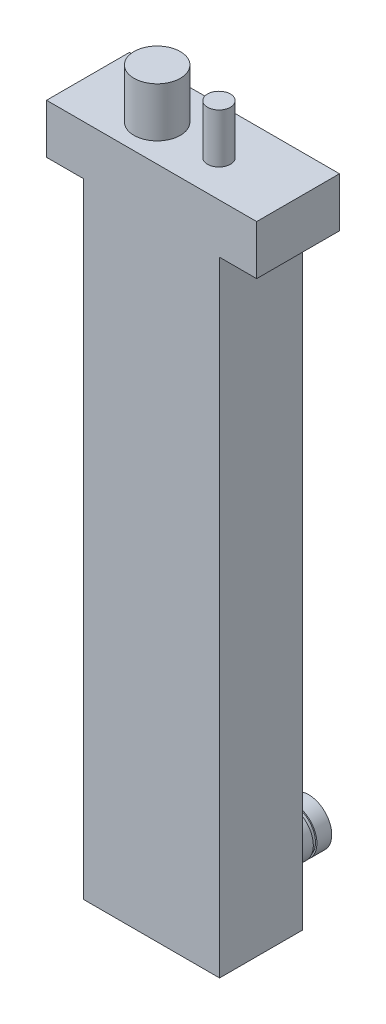
ISO-10303-21;
HEADER;
FILE_DESCRIPTION(('STEP AP214'),'2;1');
FILE_NAME('part.step','',(''),(''),'','','');
FILE_SCHEMA(('AUTOMOTIVE_DESIGN { 1 0 10303 214 1 1 1 1 }'));
ENDSEC;
DATA;
#1=APPLICATION_CONTEXT('core data for automotive mechanical design processes');
#2=APPLICATION_PROTOCOL_DEFINITION('international standard','automotive_design',2000,#1);
#3=PRODUCT_CONTEXT('',#1,'mechanical');
#4=PRODUCT('Part','Part','',(#3));
#5=PRODUCT_RELATED_PRODUCT_CATEGORY('part','',(#4));
#6=PRODUCT_DEFINITION_FORMATION('','',#4);
#7=PRODUCT_DEFINITION_CONTEXT('part definition',#1,'design');
#8=PRODUCT_DEFINITION('design','',#6,#7);
#9=PRODUCT_DEFINITION_SHAPE('','',#8);
#10=(LENGTH_UNIT() NAMED_UNIT(*) SI_UNIT(.MILLI.,.METRE.));
#11=(NAMED_UNIT(*) PLANE_ANGLE_UNIT() SI_UNIT($,.RADIAN.));
#12=(NAMED_UNIT(*) SI_UNIT($,.STERADIAN.) SOLID_ANGLE_UNIT());
#13=UNCERTAINTY_MEASURE_WITH_UNIT(LENGTH_MEASURE(1.E-05),#10,'distance_accuracy_value','');
#14=(GEOMETRIC_REPRESENTATION_CONTEXT(3) GLOBAL_UNCERTAINTY_ASSIGNED_CONTEXT((#13)) GLOBAL_UNIT_ASSIGNED_CONTEXT((#10,
#11,#12)) REPRESENTATION_CONTEXT('',''));
#15=CARTESIAN_POINT('',(0.,0.,0.));
#16=DIRECTION('',(0.,0.,1.));
#17=DIRECTION('',(1.,0.,0.));
#18=AXIS2_PLACEMENT_3D('',#15,#16,#17);
#19=CARTESIAN_POINT('',(0.,0.,0.));
#20=DIRECTION('',(0.,1.,0.));
#21=DIRECTION('',(0.,0.,1.));
#22=AXIS2_PLACEMENT_3D('',#19,#20,#21);
#23=PLANE('',#22);
#24=DIRECTION('',(1.,0.,0.));
#25=VECTOR('',#24,1.);
#26=CARTESIAN_POINT('',(0.,0.,7.493));
#27=LINE('',#26,#25);
#28=CARTESIAN_POINT('',(-26.67,0.,7.493));
#29=VERTEX_POINT('',#28);
#30=CARTESIAN_POINT('',(-19.05,0.,7.493));
#31=VERTEX_POINT('',#30);
#32=EDGE_CURVE('E172',#29,#31,#27,.T.);
#33=ORIENTED_EDGE('',*,*,#32,.F.);
#34=DIRECTION('',(0.,0.,1.));
#35=VECTOR('',#34,1.);
#36=CARTESIAN_POINT('',(-26.67,0.,-9.525));
#37=LINE('',#36,#35);
#38=CARTESIAN_POINT('',(-26.67,0.,-9.525));
#39=VERTEX_POINT('',#38);
#40=EDGE_CURVE('E214',#39,#29,#37,.T.);
#41=ORIENTED_EDGE('',*,*,#40,.F.);
#42=DIRECTION('',(-1.,0.,0.));
#43=VECTOR('',#42,1.);
#44=CARTESIAN_POINT('',(11.43,0.,-9.525));
#45=LINE('',#44,#43);
#46=CARTESIAN_POINT('',(-19.05,0.,-9.525));
#47=VERTEX_POINT('',#46);
#48=EDGE_CURVE('E114',#47,#39,#45,.T.);
#49=ORIENTED_EDGE('',*,*,#48,.F.);
#50=DIRECTION('',(0.,0.,-1.));
#51=VECTOR('',#50,1.);
#52=CARTESIAN_POINT('',(-19.05,0.,9.525));
#53=LINE('',#52,#51);
#54=EDGE_CURVE('E111',#31,#47,#53,.T.);
#55=ORIENTED_EDGE('',*,*,#54,.F.);
#56=EDGE_LOOP('',(#33,#41,#49,#55));
#57=FACE_BOUND('',#56,.T.);
#58=ADVANCED_FACE('F40',(#57),#23,.F.);
#59=DIRECTION('',(1.,0.,0.));
#60=VECTOR('',#59,1.);
#61=CARTESIAN_POINT('',(0.,0.,7.493));
#62=LINE('',#61,#60);
#63=CARTESIAN_POINT('',(8.89000000000001,0.,7.493));
#64=VERTEX_POINT('',#63);
#65=CARTESIAN_POINT('',(16.51,0.,7.493));
#66=VERTEX_POINT('',#65);
#67=EDGE_CURVE('E159',#64,#66,#62,.T.);
#68=ORIENTED_EDGE('',*,*,#67,.F.);
#69=DIRECTION('',(0.,0.,1.));
#70=VECTOR('',#69,1.);
#71=CARTESIAN_POINT('',(8.89000000000001,0.,9.525));
#72=LINE('',#71,#70);
#73=CARTESIAN_POINT('',(8.89000000000001,0.,-9.525));
#74=VERTEX_POINT('',#73);
#75=EDGE_CURVE('E128',#74,#64,#72,.T.);
#76=ORIENTED_EDGE('',*,*,#75,.F.);
#77=CARTESIAN_POINT('',(16.51,0.,-9.525));
#78=VERTEX_POINT('',#77);
#79=EDGE_CURVE('E118',#78,#74,#45,.T.);
#80=ORIENTED_EDGE('',*,*,#79,.F.);
#81=DIRECTION('',(0.,0.,-1.));
#82=VECTOR('',#81,1.);
#83=CARTESIAN_POINT('',(16.51,0.,9.52499999999999));
#84=LINE('',#83,#82);
#85=EDGE_CURVE('E123',#66,#78,#84,.T.);
#86=ORIENTED_EDGE('',*,*,#85,.F.);
#87=EDGE_LOOP('',(#68,#76,#80,#86));
#88=FACE_BOUND('',#87,.T.);
#89=ADVANCED_FACE('F234',(#88),#23,.F.);
#90=CARTESIAN_POINT('',(0.,10.16,0.));
#91=DIRECTION('',(0.,1.,0.));
#92=DIRECTION('',(0.,0.,1.));
#93=AXIS2_PLACEMENT_3D('',#90,#91,#92);
#94=PLANE('',#93);
#95=CARTESIAN_POINT('',(1.27000000000001,10.16,0.));
#96=DIRECTION('',(0.,1.,0.));
#97=DIRECTION('',(0.,0.,1.));
#98=AXIS2_PLACEMENT_3D('',#95,#96,#97);
#99=CIRCLE('',#98,2.35729593622905);
#100=CARTESIAN_POINT('',(1.27000000000001,10.16,2.35729593622905));
#101=VERTEX_POINT('',#100);
#102=EDGE_CURVE('E202',#101,#101,#99,.T.);
#103=ORIENTED_EDGE('',*,*,#102,.F.);
#104=EDGE_LOOP('',(#103));
#105=FACE_BOUND('',#104,.T.);
#106=CARTESIAN_POINT('',(-11.43,10.16,0.));
#107=DIRECTION('',(0.,1.,0.));
#108=DIRECTION('',(0.,0.,1.));
#109=AXIS2_PLACEMENT_3D('',#106,#107,#108);
#110=CIRCLE('',#109,4.7625);
#111=CARTESIAN_POINT('',(-11.43,10.16,4.7625));
#112=VERTEX_POINT('',#111);
#113=EDGE_CURVE('E194',#112,#112,#110,.T.);
#114=ORIENTED_EDGE('',*,*,#113,.F.);
#115=EDGE_LOOP('',(#114));
#116=FACE_BOUND('',#115,.T.);
#117=DIRECTION('',(0.,0.,-1.));
#118=VECTOR('',#117,1.);
#119=CARTESIAN_POINT('',(-26.67,10.16,-9.525));
#120=LINE('',#119,#118);
#121=CARTESIAN_POINT('',(-26.67,10.16,7.493));
#122=VERTEX_POINT('',#121);
#123=CARTESIAN_POINT('',(-26.67,10.16,-9.525));
#124=VERTEX_POINT('',#123);
#125=EDGE_CURVE('E211',#122,#124,#120,.T.);
#126=ORIENTED_EDGE('',*,*,#125,.F.);
#127=DIRECTION('',(-1.,0.,0.));
#128=VECTOR('',#127,1.);
#129=CARTESIAN_POINT('',(-26.67,10.16,7.493));
#130=LINE('',#129,#128);
#131=CARTESIAN_POINT('',(16.51,10.16,7.493));
#132=VERTEX_POINT('',#131);
#133=EDGE_CURVE('E160',#132,#122,#130,.T.);
#134=ORIENTED_EDGE('',*,*,#133,.F.);
#135=DIRECTION('',(0.,0.,1.));
#136=VECTOR('',#135,1.);
#137=CARTESIAN_POINT('',(16.51,10.16,9.52499999999999));
#138=LINE('',#137,#136);
#139=CARTESIAN_POINT('',(16.51,10.16,-9.525));
#140=VERTEX_POINT('',#139);
#141=EDGE_CURVE('E134',#140,#132,#138,.T.);
#142=ORIENTED_EDGE('',*,*,#141,.F.);
#143=DIRECTION('',(-1.,0.,0.));
#144=VECTOR('',#143,1.);
#145=CARTESIAN_POINT('',(11.43,10.16,-9.525));
#146=LINE('',#145,#144);
#147=EDGE_CURVE('E190',#140,#124,#146,.T.);
#148=ORIENTED_EDGE('',*,*,#147,.T.);
#149=EDGE_LOOP('',(#126,#134,#142,#148));
#150=FACE_BOUND('',#149,.T.);
#151=ADVANCED_FACE('F238',(#105,#116,#150),#94,.T.);
#152=CARTESIAN_POINT('',(-26.67,0.,0.));
#153=DIRECTION('',(1.,0.,0.));
#154=DIRECTION('',(0.,0.,-1.));
#155=AXIS2_PLACEMENT_3D('',#152,#153,#154);
#156=PLANE('',#155);
#157=DIRECTION('',(0.,-1.,0.));
#158=VECTOR('',#157,1.);
#159=CARTESIAN_POINT('',(-26.67,10.16,7.493));
#160=LINE('',#159,#158);
#161=EDGE_CURVE('E251',#122,#29,#160,.T.);
#162=ORIENTED_EDGE('',*,*,#161,.F.);
#163=ORIENTED_EDGE('',*,*,#125,.T.);
#164=DIRECTION('',(0.,-1.,0.));
#165=VECTOR('',#164,1.);
#166=CARTESIAN_POINT('',(-26.67,0.,-9.525));
#167=LINE('',#166,#165);
#168=EDGE_CURVE('E210',#124,#39,#167,.T.);
#169=ORIENTED_EDGE('',*,*,#168,.T.);
#170=ORIENTED_EDGE('',*,*,#40,.T.);
#171=EDGE_LOOP('',(#162,#163,#169,#170));
#172=FACE_BOUND('',#171,.T.);
#173=ADVANCED_FACE('F255',(#172),#156,.F.);
#174=CARTESIAN_POINT('',(16.51,0.,0.));
#175=DIRECTION('',(1.,0.,0.));
#176=DIRECTION('',(0.,0.,-1.));
#177=AXIS2_PLACEMENT_3D('',#174,#175,#176);
#178=PLANE('',#177);
#179=ORIENTED_EDGE('',*,*,#141,.T.);
#180=DIRECTION('',(0.,1.,0.));
#181=VECTOR('',#180,1.);
#182=CARTESIAN_POINT('',(16.51,10.16,7.493));
#183=LINE('',#182,#181);
#184=EDGE_CURVE('E166',#66,#132,#183,.T.);
#185=ORIENTED_EDGE('',*,*,#184,.F.);
#186=ORIENTED_EDGE('',*,*,#85,.T.);
#187=DIRECTION('',(0.,1.,0.));
#188=VECTOR('',#187,1.);
#189=CARTESIAN_POINT('',(16.51,10.16,-9.525));
#190=LINE('',#189,#188);
#191=EDGE_CURVE('E223',#78,#140,#190,.T.);
#192=ORIENTED_EDGE('',*,*,#191,.T.);
#193=EDGE_LOOP('',(#179,#185,#186,#192));
#194=FACE_BOUND('',#193,.T.);
#195=ADVANCED_FACE('F231',(#194),#178,.T.);
#196=CARTESIAN_POINT('',(-19.05,-128.27,9.525));
#197=DIRECTION('',(1.,0.,0.));
#198=DIRECTION('',(0.,0.,-1.));
#199=AXIS2_PLACEMENT_3D('',#196,#197,#198);
#200=PLANE('',#199);
#201=DIRECTION('',(0.,-1.,0.));
#202=VECTOR('',#201,1.);
#203=CARTESIAN_POINT('',(-19.05,-128.27,7.493));
#204=LINE('',#203,#202);
#205=CARTESIAN_POINT('',(-19.05,-128.27,7.493));
#206=VERTEX_POINT('',#205);
#207=EDGE_CURVE('E56',#31,#206,#204,.T.);
#208=ORIENTED_EDGE('',*,*,#207,.F.);
#209=ORIENTED_EDGE('',*,*,#54,.T.);
#210=DIRECTION('',(0.,1.,0.));
#211=VECTOR('',#210,1.);
#212=CARTESIAN_POINT('',(-19.05,-128.27,-9.525));
#213=LINE('',#212,#211);
#214=CARTESIAN_POINT('',(-19.05,-128.27,-9.525));
#215=VERTEX_POINT('',#214);
#216=EDGE_CURVE('E105',#215,#47,#213,.T.);
#217=ORIENTED_EDGE('',*,*,#216,.F.);
#218=DIRECTION('',(0.,0.,-1.));
#219=VECTOR('',#218,1.);
#220=CARTESIAN_POINT('',(-19.05,-128.27,9.525));
#221=LINE('',#220,#219);
#222=EDGE_CURVE('E91',#206,#215,#221,.T.);
#223=ORIENTED_EDGE('',*,*,#222,.F.);
#224=EDGE_LOOP('',(#208,#209,#217,#223));
#225=FACE_BOUND('',#224,.T.);
#226=ADVANCED_FACE('F109',(#225),#200,.F.);
#227=CARTESIAN_POINT('',(8.89000000000001,-128.27,9.525));
#228=DIRECTION('',(-1.,0.,0.));
#229=DIRECTION('',(0.,0.,1.));
#230=AXIS2_PLACEMENT_3D('',#227,#228,#229);
#231=PLANE('',#230);
#232=DIRECTION('',(0.,1.,0.));
#233=VECTOR('',#232,1.);
#234=CARTESIAN_POINT('',(8.89000000000001,-128.27,7.493));
#235=LINE('',#234,#233);
#236=CARTESIAN_POINT('',(8.89000000000001,-128.27,7.493));
#237=VERTEX_POINT('',#236);
#238=EDGE_CURVE('E152',#237,#64,#235,.T.);
#239=ORIENTED_EDGE('',*,*,#238,.F.);
#240=DIRECTION('',(0.,0.,1.));
#241=VECTOR('',#240,1.);
#242=CARTESIAN_POINT('',(8.89000000000001,-128.27,9.525));
#243=LINE('',#242,#241);
#244=CARTESIAN_POINT('',(8.89000000000001,-128.27,-9.525));
#245=VERTEX_POINT('',#244);
#246=EDGE_CURVE('E135',#245,#237,#243,.T.);
#247=ORIENTED_EDGE('',*,*,#246,.F.);
#248=DIRECTION('',(0.,1.,0.));
#249=VECTOR('',#248,1.);
#250=CARTESIAN_POINT('',(8.89000000000001,-128.27,-9.525));
#251=LINE('',#250,#249);
#252=EDGE_CURVE('E99',#245,#74,#251,.T.);
#253=ORIENTED_EDGE('',*,*,#252,.T.);
#254=ORIENTED_EDGE('',*,*,#75,.T.);
#255=EDGE_LOOP('',(#239,#247,#253,#254));
#256=FACE_BOUND('',#255,.T.);
#257=ADVANCED_FACE('F150',(#256),#231,.F.);
#258=CARTESIAN_POINT('',(0.,-128.27,0.));
#259=DIRECTION('',(0.,-1.,0.));
#260=DIRECTION('',(0.,0.,-1.));
#261=AXIS2_PLACEMENT_3D('',#258,#259,#260);
#262=PLANE('',#261);
#263=ORIENTED_EDGE('',*,*,#246,.T.);
#264=DIRECTION('',(-1.,0.,0.));
#265=VECTOR('',#264,1.);
#266=CARTESIAN_POINT('',(0.,-128.27,7.493));
#267=LINE('',#266,#265);
#268=EDGE_CURVE('E12',#237,#206,#267,.T.);
#269=ORIENTED_EDGE('',*,*,#268,.T.);
#270=ORIENTED_EDGE('',*,*,#222,.T.);
#271=DIRECTION('',(1.,0.,0.));
#272=VECTOR('',#271,1.);
#273=CARTESIAN_POINT('',(-19.05,-128.27,-9.525));
#274=LINE('',#273,#272);
#275=CARTESIAN_POINT('',(-5.07999999999999,-128.27,-9.525));
#276=VERTEX_POINT('',#275);
#277=EDGE_CURVE('E95',#215,#276,#274,.T.);
#278=ORIENTED_EDGE('',*,*,#277,.T.);
#279=EDGE_CURVE('E107',#276,#245,#274,.T.);
#280=ORIENTED_EDGE('',*,*,#279,.T.);
#281=EDGE_LOOP('',(#263,#269,#270,#278,#280));
#282=FACE_BOUND('',#281,.T.);
#283=ADVANCED_FACE('F94',(#282),#262,.T.);
#284=CARTESIAN_POINT('',(11.43,10.16,-9.525));
#285=DIRECTION('',(0.,0.,1.));
#286=DIRECTION('',(1.,0.,0.));
#287=AXIS2_PLACEMENT_3D('',#284,#285,#286);
#288=PLANE('',#287);
#289=ORIENTED_EDGE('',*,*,#279,.F.);
#290=CARTESIAN_POINT('',(-5.07999999999999,-123.5075,-9.525));
#291=DIRECTION('',(0.,0.,1.));
#292=DIRECTION('',(1.,0.,0.));
#293=AXIS2_PLACEMENT_3D('',#290,#291,#292);
#294=CIRCLE('',#293,4.76249999999999);
#295=EDGE_CURVE('E62',#276,#276,#294,.T.);
#296=ORIENTED_EDGE('',*,*,#295,.T.);
#297=ORIENTED_EDGE('',*,*,#277,.F.);
#298=ORIENTED_EDGE('',*,*,#216,.T.);
#299=ORIENTED_EDGE('',*,*,#48,.T.);
#300=ORIENTED_EDGE('',*,*,#168,.F.);
#301=ORIENTED_EDGE('',*,*,#147,.F.);
#302=ORIENTED_EDGE('',*,*,#191,.F.);
#303=ORIENTED_EDGE('',*,*,#79,.T.);
#304=ORIENTED_EDGE('',*,*,#252,.F.);
#305=EDGE_LOOP('',(#289,#296,#297,#298,#299,#300,#301,#302,#303,#304));
#306=FACE_BOUND('',#305,.T.);
#307=ADVANCED_FACE('F104',(#306),#288,.F.);
#308=CARTESIAN_POINT('',(-11.43,20.32,0.));
#309=DIRECTION('',(0.,-1.,0.));
#310=DIRECTION('',(0.,0.,-1.));
#311=AXIS2_PLACEMENT_3D('',#308,#309,#310);
#312=CYLINDRICAL_SURFACE('',#311,4.7625);
#313=CARTESIAN_POINT('',(-11.43,20.32,0.));
#314=DIRECTION('',(0.,1.,0.));
#315=DIRECTION('',(0.,0.,1.));
#316=AXIS2_PLACEMENT_3D('',#313,#314,#315);
#317=CIRCLE('',#316,4.7625);
#318=CARTESIAN_POINT('',(-11.43,20.32,4.7625));
#319=VERTEX_POINT('',#318);
#320=EDGE_CURVE('E198',#319,#319,#317,.T.);
#321=ORIENTED_EDGE('',*,*,#320,.F.);
#322=EDGE_LOOP('',(#321));
#323=FACE_BOUND('',#322,.T.);
#324=ORIENTED_EDGE('',*,*,#113,.T.);
#325=EDGE_LOOP('',(#324));
#326=FACE_BOUND('',#325,.T.);
#327=ADVANCED_FACE('F277',(#323,#326),#312,.T.);
#328=CARTESIAN_POINT('',(-11.43,20.32,0.));
#329=DIRECTION('',(0.,1.,0.));
#330=DIRECTION('',(0.,0.,1.));
#331=AXIS2_PLACEMENT_3D('',#328,#329,#330);
#332=PLANE('',#331);
#333=ORIENTED_EDGE('',*,*,#320,.T.);
#334=EDGE_LOOP('',(#333));
#335=FACE_BOUND('',#334,.T.);
#336=ADVANCED_FACE('F280',(#335),#332,.T.);
#337=CARTESIAN_POINT('',(1.27000000000001,20.32,0.));
#338=DIRECTION('',(0.,-1.,0.));
#339=DIRECTION('',(0.,0.,-1.));
#340=AXIS2_PLACEMENT_3D('',#337,#338,#339);
#341=CYLINDRICAL_SURFACE('',#340,2.35729593622905);
#342=CARTESIAN_POINT('',(1.27000000000001,20.32,0.));
#343=DIRECTION('',(0.,1.,0.));
#344=DIRECTION('',(0.,0.,1.));
#345=AXIS2_PLACEMENT_3D('',#342,#343,#344);
#346=CIRCLE('',#345,2.35729593622905);
#347=CARTESIAN_POINT('',(1.27000000000001,20.32,2.35729593622905));
#348=VERTEX_POINT('',#347);
#349=EDGE_CURVE('E206',#348,#348,#346,.T.);
#350=ORIENTED_EDGE('',*,*,#349,.F.);
#351=EDGE_LOOP('',(#350));
#352=FACE_BOUND('',#351,.T.);
#353=ORIENTED_EDGE('',*,*,#102,.T.);
#354=EDGE_LOOP('',(#353));
#355=FACE_BOUND('',#354,.T.);
#356=ADVANCED_FACE('F284',(#352,#355),#341,.T.);
#357=CARTESIAN_POINT('',(1.27000000000001,20.32,0.));
#358=DIRECTION('',(0.,1.,0.));
#359=DIRECTION('',(0.,0.,1.));
#360=AXIS2_PLACEMENT_3D('',#357,#358,#359);
#361=PLANE('',#360);
#362=ORIENTED_EDGE('',*,*,#349,.T.);
#363=EDGE_LOOP('',(#362));
#364=FACE_BOUND('',#363,.T.);
#365=ADVANCED_FACE('F287',(#364),#361,.T.);
#366=CARTESIAN_POINT('',(-5.07999999999999,-123.5075,-24.765));
#367=DIRECTION('',(0.,0.,1.));
#368=DIRECTION('',(1.,0.,0.));
#369=AXIS2_PLACEMENT_3D('',#366,#367,#368);
#370=CYLINDRICAL_SURFACE('',#369,4.76249999999999);
#371=CARTESIAN_POINT('',(-5.07999999999999,-123.5075,-20.9804));
#372=DIRECTION('',(0.,0.,1.));
#373=DIRECTION('',(1.,0.,0.));
#374=AXIS2_PLACEMENT_3D('',#371,#372,#373);
#375=CIRCLE('',#374,4.76249999999999);
#376=CARTESIAN_POINT('',(-0.317499999999991,-123.5075,-20.9804));
#377=VERTEX_POINT('',#376);
#378=EDGE_CURVE('E137',#377,#377,#375,.F.);
#379=ORIENTED_EDGE('',*,*,#378,.F.);
#380=EDGE_LOOP('',(#379));
#381=FACE_BOUND('',#380,.T.);
#382=ORIENTED_EDGE('',*,*,#295,.F.);
#383=EDGE_LOOP('',(#382));
#384=FACE_BOUND('',#383,.T.);
#385=ADVANCED_FACE('F42',(#381,#384),#370,.T.);
#386=CARTESIAN_POINT('',(0.,0.,-20.9804));
#387=DIRECTION('',(0.,0.,1.));
#388=DIRECTION('',(1.,0.,0.));
#389=AXIS2_PLACEMENT_3D('',#386,#387,#388);
#390=PLANE('',#389);
#391=CARTESIAN_POINT('',(-5.07999999999999,-123.5075,-20.9804));
#392=DIRECTION('',(0.,0.,-1.));
#393=DIRECTION('',(-1.,0.,0.));
#394=AXIS2_PLACEMENT_3D('',#391,#392,#393);
#395=CIRCLE('',#394,4.4704);
#396=CARTESIAN_POINT('',(-9.55039999999999,-123.5075,-20.9804));
#397=VERTEX_POINT('',#396);
#398=EDGE_CURVE('E49',#397,#397,#395,.T.);
#399=ORIENTED_EDGE('',*,*,#398,.F.);
#400=EDGE_LOOP('',(#399));
#401=FACE_BOUND('',#400,.T.);
#402=ORIENTED_EDGE('',*,*,#378,.T.);
#403=EDGE_LOOP('',(#402));
#404=FACE_BOUND('',#403,.T.);
#405=ADVANCED_FACE('F294',(#401,#404),#390,.F.);
#406=CARTESIAN_POINT('',(-5.07999999999999,-123.5075,-34.3612006184653));
#407=DIRECTION('',(0.,0.,1.));
#408=DIRECTION('',(1.,0.,0.));
#409=AXIS2_PLACEMENT_3D('',#406,#407,#408);
#410=CYLINDRICAL_SURFACE('',#409,4.4704);
#411=CARTESIAN_POINT('',(-5.07999999999999,-123.5075,-21.717));
#412=DIRECTION('',(0.,0.,1.));
#413=DIRECTION('',(1.,0.,0.));
#414=AXIS2_PLACEMENT_3D('',#411,#412,#413);
#415=CIRCLE('',#414,4.4704);
#416=CARTESIAN_POINT('',(-0.609599999999987,-123.5075,-21.717));
#417=VERTEX_POINT('',#416);
#418=EDGE_CURVE('E120',#417,#417,#415,.T.);
#419=ORIENTED_EDGE('',*,*,#418,.T.);
#420=EDGE_LOOP('',(#419));
#421=FACE_BOUND('',#420,.T.);
#422=ORIENTED_EDGE('',*,*,#398,.T.);
#423=EDGE_LOOP('',(#422));
#424=FACE_BOUND('',#423,.T.);
#425=ADVANCED_FACE('F305',(#421,#424),#410,.T.);
#426=CARTESIAN_POINT('',(-5.07999999999999,-123.5075,-24.765));
#427=DIRECTION('',(0.,0.,-1.));
#428=DIRECTION('',(1.,0.,0.));
#429=AXIS2_PLACEMENT_3D('',#426,#427,#428);
#430=PLANE('',#429);
#431=CARTESIAN_POINT('',(-5.07999999999999,-123.5075,-24.765));
#432=DIRECTION('',(0.,0.,1.));
#433=DIRECTION('',(1.,0.,0.));
#434=AXIS2_PLACEMENT_3D('',#431,#432,#433);
#435=CIRCLE('',#434,4.76249999999999);
#436=CARTESIAN_POINT('',(-0.317499999999991,-123.5075,-24.765));
#437=VERTEX_POINT('',#436);
#438=EDGE_CURVE('E176',#437,#437,#435,.T.);
#439=ORIENTED_EDGE('',*,*,#438,.F.);
#440=EDGE_LOOP('',(#439));
#441=FACE_BOUND('',#440,.T.);
#442=ADVANCED_FACE('F312',(#441),#430,.T.);
#443=CARTESIAN_POINT('',(-5.07999999999999,-123.5075,-24.765));
#444=DIRECTION('',(0.,0.,1.));
#445=DIRECTION('',(1.,0.,0.));
#446=AXIS2_PLACEMENT_3D('',#443,#444,#445);
#447=CYLINDRICAL_SURFACE('',#446,4.76249999999999);
#448=CARTESIAN_POINT('',(-5.07999999999999,-123.5075,-21.717));
#449=DIRECTION('',(0.,0.,1.));
#450=DIRECTION('',(1.,0.,0.));
#451=AXIS2_PLACEMENT_3D('',#448,#449,#450);
#452=CIRCLE('',#451,4.76249999999999);
#453=CARTESIAN_POINT('',(-0.317499999999991,-123.5075,-21.717));
#454=VERTEX_POINT('',#453);
#455=EDGE_CURVE('E175',#454,#454,#452,.F.);
#456=CARTESIAN_POINT('',(-0.317499999999991,-123.5075,-24.765));
#457=CARTESIAN_POINT('',(-0.317499999999991,-123.5075,-24.73325));
#458=CARTESIAN_POINT('',(-0.317499999999991,-123.5075,-24.7015));
#459=CARTESIAN_POINT('',(-0.317499999999991,-123.5075,-24.638));
#460=CARTESIAN_POINT('',(-0.317499999999991,-123.5075,-24.60625));
#461=CARTESIAN_POINT('',(-0.317499999999991,-123.5075,-24.54275));
#462=CARTESIAN_POINT('',(-0.317499999999991,-123.5075,-24.511));
#463=CARTESIAN_POINT('',(-0.317499999999991,-123.5075,-24.4475));
#464=CARTESIAN_POINT('',(-0.317499999999991,-123.5075,-24.41575));
#465=CARTESIAN_POINT('',(-0.317499999999991,-123.5075,-24.35225));
#466=CARTESIAN_POINT('',(-0.317499999999991,-123.5075,-24.3205));
#467=CARTESIAN_POINT('',(-0.317499999999991,-123.5075,-24.257));
#468=CARTESIAN_POINT('',(-0.317499999999991,-123.5075,-24.22525));
#469=CARTESIAN_POINT('',(-0.317499999999991,-123.5075,-24.16175));
#470=CARTESIAN_POINT('',(-0.317499999999991,-123.5075,-24.13));
#471=CARTESIAN_POINT('',(-0.317499999999991,-123.5075,-24.0665));
#472=CARTESIAN_POINT('',(-0.317499999999991,-123.5075,-24.03475));
#473=CARTESIAN_POINT('',(-0.317499999999991,-123.5075,-23.97125));
#474=CARTESIAN_POINT('',(-0.317499999999991,-123.5075,-23.9395));
#475=CARTESIAN_POINT('',(-0.317499999999991,-123.5075,-23.876));
#476=CARTESIAN_POINT('',(-0.317499999999991,-123.5075,-23.84425));
#477=CARTESIAN_POINT('',(-0.317499999999991,-123.5075,-23.78075));
#478=CARTESIAN_POINT('',(-0.317499999999991,-123.5075,-23.749));
#479=CARTESIAN_POINT('',(-0.317499999999991,-123.5075,-23.6855));
#480=CARTESIAN_POINT('',(-0.317499999999991,-123.5075,-23.65375));
#481=CARTESIAN_POINT('',(-0.317499999999991,-123.5075,-23.59025));
#482=CARTESIAN_POINT('',(-0.317499999999991,-123.5075,-23.5585));
#483=CARTESIAN_POINT('',(-0.317499999999991,-123.5075,-23.495));
#484=CARTESIAN_POINT('',(-0.317499999999991,-123.5075,-23.46325));
#485=CARTESIAN_POINT('',(-0.317499999999991,-123.5075,-23.39975));
#486=CARTESIAN_POINT('',(-0.317499999999991,-123.5075,-23.368));
#487=CARTESIAN_POINT('',(-0.317499999999991,-123.5075,-23.3045));
#488=CARTESIAN_POINT('',(-0.317499999999991,-123.5075,-23.27275));
#489=CARTESIAN_POINT('',(-0.317499999999991,-123.5075,-23.20925));
#490=CARTESIAN_POINT('',(-0.317499999999991,-123.5075,-23.1775));
#491=CARTESIAN_POINT('',(-0.317499999999991,-123.5075,-23.114));
#492=CARTESIAN_POINT('',(-0.317499999999991,-123.5075,-23.08225));
#493=CARTESIAN_POINT('',(-0.317499999999991,-123.5075,-23.01875));
#494=CARTESIAN_POINT('',(-0.317499999999991,-123.5075,-22.987));
#495=CARTESIAN_POINT('',(-0.317499999999991,-123.5075,-22.9235));
#496=CARTESIAN_POINT('',(-0.317499999999991,-123.5075,-22.89175));
#497=CARTESIAN_POINT('',(-0.317499999999991,-123.5075,-22.82825));
#498=CARTESIAN_POINT('',(-0.317499999999991,-123.5075,-22.7965));
#499=CARTESIAN_POINT('',(-0.317499999999991,-123.5075,-22.733));
#500=CARTESIAN_POINT('',(-0.317499999999991,-123.5075,-22.70125));
#501=CARTESIAN_POINT('',(-0.317499999999991,-123.5075,-22.63775));
#502=CARTESIAN_POINT('',(-0.317499999999991,-123.5075,-22.606));
#503=CARTESIAN_POINT('',(-0.317499999999991,-123.5075,-22.5425));
#504=CARTESIAN_POINT('',(-0.317499999999991,-123.5075,-22.51075));
#505=CARTESIAN_POINT('',(-0.317499999999991,-123.5075,-22.44725));
#506=CARTESIAN_POINT('',(-0.317499999999991,-123.5075,-22.4155));
#507=CARTESIAN_POINT('',(-0.317499999999991,-123.5075,-22.352));
#508=CARTESIAN_POINT('',(-0.317499999999991,-123.5075,-22.32025));
#509=CARTESIAN_POINT('',(-0.317499999999991,-123.5075,-22.25675));
#510=CARTESIAN_POINT('',(-0.317499999999991,-123.5075,-22.225));
#511=CARTESIAN_POINT('',(-0.317499999999991,-123.5075,-22.1615));
#512=CARTESIAN_POINT('',(-0.317499999999991,-123.5075,-22.12975));
#513=CARTESIAN_POINT('',(-0.317499999999991,-123.5075,-22.06625));
#514=CARTESIAN_POINT('',(-0.317499999999991,-123.5075,-22.0345));
#515=CARTESIAN_POINT('',(-0.317499999999991,-123.5075,-21.971));
#516=CARTESIAN_POINT('',(-0.317499999999991,-123.5075,-21.93925));
#517=CARTESIAN_POINT('',(-0.317499999999991,-123.5075,-21.87575));
#518=CARTESIAN_POINT('',(-0.317499999999991,-123.5075,-21.844));
#519=CARTESIAN_POINT('',(-0.317499999999991,-123.5075,-21.7805));
#520=CARTESIAN_POINT('',(-0.317499999999991,-123.5075,-21.74875));
#521=CARTESIAN_POINT('',(-0.317499999999991,-123.5075,-21.717));
#522=B_SPLINE_CURVE_WITH_KNOTS('',3,(#456,#457,#458,#459,#460,#461,#462,#463,#464,#465,#466,
#467,#468,#469,#470,#471,#472,#473,#474,#475,#476,#477,#478,#479,#480,#481,#482,#483,#484,#485,
#486,#487,#488,#489,#490,#491,#492,#493,#494,#495,#496,#497,#498,#499,#500,#501,#502,#503,#504,
#505,#506,#507,#508,#509,#510,#511,#512,#513,#514,#515,#516,#517,#518,#519,#520,#521),
.UNSPECIFIED.,.F.,.F.,(4,2,2,2,2,2,2,2,2,2,2,2,2,2,2,2,2,2,2,2,2,2,2,2,2,2,2,2,2,2,2,2,4),(0.,
0.0952499999999981,0.1905,0.285749999999998,0.380999999999999,0.476250000000001,
0.571499999999999,0.666750000000001,0.761999999999999,0.85725,0.952500000000002,1.04775,1.143,
1.23825,1.3335,1.42875,1.524,1.61925,1.7145,1.80975,1.905,2.00025,2.0955,2.19075000000001,2.286,
2.38125,2.47650000000001,2.57175,2.66700000000001,2.76225000000001,2.85750000000001,
2.95275000000001,3.04800000000001),.UNSPECIFIED.);
#523=EDGE_CURVE('BSEAM379',#437,#454,#522,.T.);
#524=ORIENTED_EDGE('',*,*,#438,.T.);
#525=ORIENTED_EDGE('',*,*,#455,.T.);
#526=ORIENTED_EDGE('',*,*,#523,.T.);
#527=ORIENTED_EDGE('',*,*,#523,.F.);
#528=EDGE_LOOP('',(#524,#526,#525,#527));
#529=FACE_BOUND('',#528,.T.);
#530=ADVANCED_FACE('F379',(#529),#447,.T.);
#531=CARTESIAN_POINT('',(0.,0.,-21.717));
#532=DIRECTION('',(0.,0.,1.));
#533=DIRECTION('',(1.,0.,0.));
#534=AXIS2_PLACEMENT_3D('',#531,#532,#533);
#535=PLANE('',#534);
#536=ORIENTED_EDGE('',*,*,#418,.F.);
#537=EDGE_LOOP('',(#536));
#538=FACE_BOUND('',#537,.T.);
#539=ORIENTED_EDGE('',*,*,#455,.F.);
#540=EDGE_LOOP('',(#539));
#541=FACE_BOUND('',#540,.T.);
#542=ADVANCED_FACE('F389',(#538,#541),#535,.T.);
#543=CARTESIAN_POINT('',(0.,0.,7.493));
#544=DIRECTION('',(0.,0.,1.));
#545=DIRECTION('',(1.,0.,0.));
#546=AXIS2_PLACEMENT_3D('',#543,#544,#545);
#547=PLANE('',#546);
#548=ORIENTED_EDGE('',*,*,#32,.T.);
#549=ORIENTED_EDGE('',*,*,#207,.T.);
#550=ORIENTED_EDGE('',*,*,#268,.F.);
#551=ORIENTED_EDGE('',*,*,#238,.T.);
#552=ORIENTED_EDGE('',*,*,#67,.T.);
#553=ORIENTED_EDGE('',*,*,#184,.T.);
#554=ORIENTED_EDGE('',*,*,#133,.T.);
#555=ORIENTED_EDGE('',*,*,#161,.T.);
#556=EDGE_LOOP('',(#548,#549,#550,#551,#552,#553,#554,#555));
#557=FACE_BOUND('',#556,.T.);
#558=ADVANCED_FACE('F249',(#557),#547,.T.);
#559=CLOSED_SHELL('',(#58,#89,#151,#173,#195,#226,#257,#283,#307,#327,#336,#356,#365,#385,#405,
#425,#442,#530,#542,#558));
#560=MANIFOLD_SOLID_BREP('B2',#559);
#561=ADVANCED_BREP_SHAPE_REPRESENTATION('',(#18,#560),#14);
#562=SHAPE_DEFINITION_REPRESENTATION(#9,#561);
ENDSEC;
END-ISO-10303-21;
